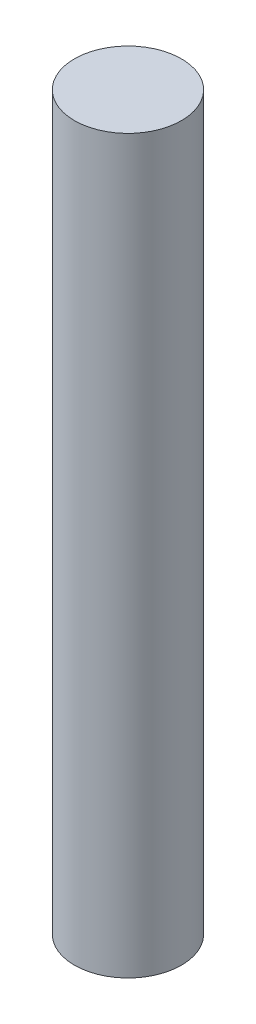
ISO-10303-21;
HEADER;
FILE_DESCRIPTION(('STEP AP214'),'2;1');
FILE_NAME('part.step','',(''),(''),'','','');
FILE_SCHEMA(('AUTOMOTIVE_DESIGN { 1 0 10303 214 1 1 1 1 }'));
ENDSEC;
DATA;
#1=APPLICATION_CONTEXT('core data for automotive mechanical design processes');
#2=APPLICATION_PROTOCOL_DEFINITION('international standard','automotive_design',2000,#1);
#3=PRODUCT_CONTEXT('',#1,'mechanical');
#4=PRODUCT('Part','Part','',(#3));
#5=PRODUCT_RELATED_PRODUCT_CATEGORY('part','',(#4));
#6=PRODUCT_DEFINITION_FORMATION('','',#4);
#7=PRODUCT_DEFINITION_CONTEXT('part definition',#1,'design');
#8=PRODUCT_DEFINITION('design','',#6,#7);
#9=PRODUCT_DEFINITION_SHAPE('','',#8);
#10=(LENGTH_UNIT() NAMED_UNIT(*) SI_UNIT(.MILLI.,.METRE.));
#11=(NAMED_UNIT(*) PLANE_ANGLE_UNIT() SI_UNIT($,.RADIAN.));
#12=(NAMED_UNIT(*) SI_UNIT($,.STERADIAN.) SOLID_ANGLE_UNIT());
#13=UNCERTAINTY_MEASURE_WITH_UNIT(LENGTH_MEASURE(1.E-05),#10,'distance_accuracy_value','');
#14=(GEOMETRIC_REPRESENTATION_CONTEXT(3) GLOBAL_UNCERTAINTY_ASSIGNED_CONTEXT((#13)) GLOBAL_UNIT_ASSIGNED_CONTEXT((#10,
#11,#12)) REPRESENTATION_CONTEXT('',''));
#15=CARTESIAN_POINT('',(0.,0.,0.));
#16=DIRECTION('',(0.,0.,1.));
#17=DIRECTION('',(1.,0.,0.));
#18=AXIS2_PLACEMENT_3D('',#15,#16,#17);
#19=CARTESIAN_POINT('',(0.,41.,0.));
#20=DIRECTION('',(0.,-1.,0.));
#21=DIRECTION('',(0.,0.,-1.));
#22=AXIS2_PLACEMENT_3D('',#19,#20,#21);
#23=CYLINDRICAL_SURFACE('',#22,3.);
#24=CARTESIAN_POINT('',(0.,41.,0.));
#25=DIRECTION('',(0.,1.,0.));
#26=DIRECTION('',(0.,0.,1.));
#27=AXIS2_PLACEMENT_3D('',#24,#25,#26);
#28=CIRCLE('',#27,3.);
#29=CARTESIAN_POINT('',(0.,41.,3.));
#30=VERTEX_POINT('',#29);
#31=EDGE_CURVE('E10',#30,#30,#28,.T.);
#32=ORIENTED_EDGE('',*,*,#31,.F.);
#33=EDGE_LOOP('',(#32));
#34=FACE_BOUND('',#33,.T.);
#35=CARTESIAN_POINT('',(0.,0.,0.));
#36=DIRECTION('',(0.,1.,0.));
#37=DIRECTION('',(0.,0.,1.));
#38=AXIS2_PLACEMENT_3D('',#35,#36,#37);
#39=CIRCLE('',#38,3.);
#40=CARTESIAN_POINT('',(0.,0.,3.));
#41=VERTEX_POINT('',#40);
#42=EDGE_CURVE('E42',#41,#41,#39,.T.);
#43=ORIENTED_EDGE('',*,*,#42,.T.);
#44=EDGE_LOOP('',(#43));
#45=FACE_BOUND('',#44,.T.);
#46=ADVANCED_FACE('F39',(#34,#45),#23,.T.);
#47=CARTESIAN_POINT('',(0.,41.,0.));
#48=DIRECTION('',(0.,1.,0.));
#49=DIRECTION('',(0.,0.,1.));
#50=AXIS2_PLACEMENT_3D('',#47,#48,#49);
#51=PLANE('',#50);
#52=ORIENTED_EDGE('',*,*,#31,.T.);
#53=EDGE_LOOP('',(#52));
#54=FACE_BOUND('',#53,.T.);
#55=ADVANCED_FACE('F54',(#54),#51,.T.);
#56=CARTESIAN_POINT('',(0.,0.,0.));
#57=DIRECTION('',(0.,1.,0.));
#58=DIRECTION('',(0.,0.,1.));
#59=AXIS2_PLACEMENT_3D('',#56,#57,#58);
#60=PLANE('',#59);
#61=ORIENTED_EDGE('',*,*,#42,.F.);
#62=EDGE_LOOP('',(#61));
#63=FACE_BOUND('',#62,.T.);
#64=ADVANCED_FACE('F52',(#63),#60,.F.);
#65=CLOSED_SHELL('',(#46,#55,#64));
#66=MANIFOLD_SOLID_BREP('B2',#65);
#67=ADVANCED_BREP_SHAPE_REPRESENTATION('',(#18,#66),#14);
#68=SHAPE_DEFINITION_REPRESENTATION(#9,#67);
ENDSEC;
END-ISO-10303-21;
